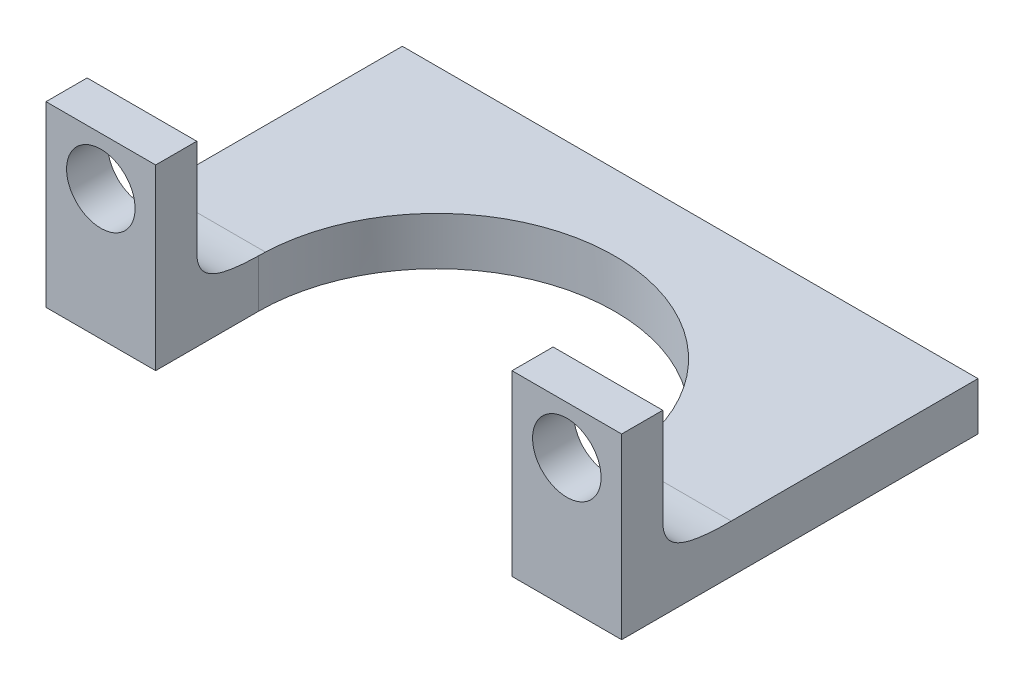
ISO-10303-21;
HEADER;
FILE_DESCRIPTION(('STEP AP214'),'2;1');
FILE_NAME('part.step','',(''),(''),'','','');
FILE_SCHEMA(('AUTOMOTIVE_DESIGN { 1 0 10303 214 1 1 1 1 }'));
ENDSEC;
DATA;
#1=APPLICATION_CONTEXT('core data for automotive mechanical design processes');
#2=APPLICATION_PROTOCOL_DEFINITION('international standard','automotive_design',2000,#1);
#3=PRODUCT_CONTEXT('',#1,'mechanical');
#4=PRODUCT('Part','Part','',(#3));
#5=PRODUCT_RELATED_PRODUCT_CATEGORY('part','',(#4));
#6=PRODUCT_DEFINITION_FORMATION('','',#4);
#7=PRODUCT_DEFINITION_CONTEXT('part definition',#1,'design');
#8=PRODUCT_DEFINITION('design','',#6,#7);
#9=PRODUCT_DEFINITION_SHAPE('','',#8);
#10=(LENGTH_UNIT() NAMED_UNIT(*) SI_UNIT(.MILLI.,.METRE.));
#11=(NAMED_UNIT(*) PLANE_ANGLE_UNIT() SI_UNIT($,.RADIAN.));
#12=(NAMED_UNIT(*) SI_UNIT($,.STERADIAN.) SOLID_ANGLE_UNIT());
#13=UNCERTAINTY_MEASURE_WITH_UNIT(LENGTH_MEASURE(1.E-05),#10,'distance_accuracy_value','');
#14=(GEOMETRIC_REPRESENTATION_CONTEXT(3) GLOBAL_UNCERTAINTY_ASSIGNED_CONTEXT((#13)) GLOBAL_UNIT_ASSIGNED_CONTEXT((#10,
#11,#12)) REPRESENTATION_CONTEXT('',''));
#15=CARTESIAN_POINT('',(0.,0.,0.));
#16=DIRECTION('',(0.,0.,1.));
#17=DIRECTION('',(1.,0.,0.));
#18=AXIS2_PLACEMENT_3D('',#15,#16,#17);
#19=CARTESIAN_POINT('',(-21.,3.5,13.));
#20=DIRECTION('',(0.,0.,-1.));
#21=DIRECTION('',(-1.,0.,0.));
#22=AXIS2_PLACEMENT_3D('',#19,#20,#21);
#23=PLANE('',#22);
#24=CARTESIAN_POINT('',(17.,9.5,13.));
#25=DIRECTION('',(0.,0.,-1.));
#26=DIRECTION('',(-1.,0.,0.));
#27=AXIS2_PLACEMENT_3D('',#24,#25,#26);
#28=CIRCLE('',#27,2.5);
#29=CARTESIAN_POINT('',(14.5,9.5,13.));
#30=VERTEX_POINT('',#29);
#31=EDGE_CURVE('E364',#30,#30,#28,.F.);
#32=ORIENTED_EDGE('',*,*,#31,.F.);
#33=EDGE_LOOP('',(#32));
#34=FACE_BOUND('',#33,.T.);
#35=DIRECTION('',(1.,0.,0.));
#36=VECTOR('',#35,1.);
#37=CARTESIAN_POINT('',(-21.,13.,13.));
#38=LINE('',#37,#36);
#39=CARTESIAN_POINT('',(13.,13.,13.));
#40=VERTEX_POINT('',#39);
#41=CARTESIAN_POINT('',(21.,13.,13.));
#42=VERTEX_POINT('',#41);
#43=EDGE_CURVE('E159',#40,#42,#38,.T.);
#44=ORIENTED_EDGE('',*,*,#43,.F.);
#45=DIRECTION('',(0.,-1.,0.));
#46=VECTOR('',#45,1.);
#47=CARTESIAN_POINT('',(13.,46.1096662622866,13.));
#48=LINE('',#47,#46);
#49=CARTESIAN_POINT('',(13.,0.,13.));
#50=VERTEX_POINT('',#49);
#51=EDGE_CURVE('E143',#40,#50,#48,.T.);
#52=ORIENTED_EDGE('',*,*,#51,.T.);
#53=DIRECTION('',(1.,0.,0.));
#54=VECTOR('',#53,1.);
#55=CARTESIAN_POINT('',(-21.,0.,13.));
#56=LINE('',#55,#54);
#57=CARTESIAN_POINT('',(21.,0.,13.));
#58=VERTEX_POINT('',#57);
#59=EDGE_CURVE('E509',#50,#58,#56,.T.);
#60=ORIENTED_EDGE('',*,*,#59,.T.);
#61=DIRECTION('',(0.,-1.,0.));
#62=VECTOR('',#61,1.);
#63=CARTESIAN_POINT('',(21.,3.5,13.));
#64=LINE('',#63,#62);
#65=EDGE_CURVE('E167',#42,#58,#64,.T.);
#66=ORIENTED_EDGE('',*,*,#65,.F.);
#67=EDGE_LOOP('',(#44,#52,#60,#66));
#68=FACE_BOUND('',#67,.T.);
#69=ADVANCED_FACE('F38',(#34,#68),#23,.F.);
#70=CARTESIAN_POINT('',(-21.,13.,10.));
#71=DIRECTION('',(0.,0.,1.));
#72=DIRECTION('',(1.,0.,0.));
#73=AXIS2_PLACEMENT_3D('',#70,#71,#72);
#74=PLANE('',#73);
#75=CARTESIAN_POINT('',(17.,9.5,10.));
#76=DIRECTION('',(0.,0.,-1.));
#77=DIRECTION('',(-1.,0.,0.));
#78=AXIS2_PLACEMENT_3D('',#75,#76,#77);
#79=CIRCLE('',#78,2.5);
#80=CARTESIAN_POINT('',(14.5,9.5,10.));
#81=VERTEX_POINT('',#80);
#82=EDGE_CURVE('E367',#81,#81,#79,.T.);
#83=ORIENTED_EDGE('',*,*,#82,.F.);
#84=EDGE_LOOP('',(#83));
#85=FACE_BOUND('',#84,.T.);
#86=DIRECTION('',(0.,-1.,0.));
#87=VECTOR('',#86,1.);
#88=CARTESIAN_POINT('',(21.,13.,10.));
#89=LINE('',#88,#87);
#90=CARTESIAN_POINT('',(21.,13.,10.));
#91=VERTEX_POINT('',#90);
#92=CARTESIAN_POINT('',(21.,6.,10.));
#93=VERTEX_POINT('',#92);
#94=EDGE_CURVE('E214',#91,#93,#89,.T.);
#95=ORIENTED_EDGE('',*,*,#94,.T.);
#96=CARTESIAN_POINT('',(12.5899001096049,6.,10.));
#97=CARTESIAN_POINT('',(15.5267603887905,6.,10.));
#98=CARTESIAN_POINT('',(18.4636206679761,6.,10.));
#99=CARTESIAN_POINT('',(21.4004809471617,6.,10.));
#100=(BOUNDED_CURVE() B_SPLINE_CURVE(3,(#96,#97,#98,#99),.UNSPECIFIED.,.F.,
.F.) B_SPLINE_CURVE_WITH_KNOTS((4,4),(-0.0424004809471617,-0.0335899001096049),
.UNSPECIFIED.) CURVE() GEOMETRIC_REPRESENTATION_ITEM() RATIONAL_B_SPLINE_CURVE((1.,1.,1.,1.)) REPRESENTATION_ITEM(''));
#101=CARTESIAN_POINT('',(13.,6.,10.));
#102=VERTEX_POINT('',#101);
#103=EDGE_CURVE('E163',#93,#102,#100,.F.);
#104=ORIENTED_EDGE('',*,*,#103,.T.);
#105=DIRECTION('',(0.,1.,0.));
#106=VECTOR('',#105,1.);
#107=CARTESIAN_POINT('',(13.,13.,10.));
#108=LINE('',#107,#106);
#109=CARTESIAN_POINT('',(13.,13.,10.));
#110=VERTEX_POINT('',#109);
#111=EDGE_CURVE('E198',#102,#110,#108,.T.);
#112=ORIENTED_EDGE('',*,*,#111,.T.);
#113=DIRECTION('',(-1.,0.,0.));
#114=VECTOR('',#113,1.);
#115=CARTESIAN_POINT('',(-21.,13.,10.));
#116=LINE('',#115,#114);
#117=EDGE_CURVE('E162',#91,#110,#116,.T.);
#118=ORIENTED_EDGE('',*,*,#117,.F.);
#119=EDGE_LOOP('',(#95,#104,#112,#118));
#120=FACE_BOUND('',#119,.T.);
#121=ADVANCED_FACE('F212',(#85,#120),#74,.F.);
#122=CARTESIAN_POINT('',(0.,13.,0.));
#123=DIRECTION('',(0.,1.,0.));
#124=DIRECTION('',(0.,0.,1.));
#125=AXIS2_PLACEMENT_3D('',#122,#123,#124);
#126=PLANE('',#125);
#127=DIRECTION('',(0.,0.,-1.));
#128=VECTOR('',#127,1.);
#129=CARTESIAN_POINT('',(13.,13.,0.));
#130=LINE('',#129,#128);
#131=EDGE_CURVE('E147',#40,#110,#130,.T.);
#132=ORIENTED_EDGE('',*,*,#131,.F.);
#133=ORIENTED_EDGE('',*,*,#43,.T.);
#134=DIRECTION('',(0.,0.,-1.));
#135=VECTOR('',#134,1.);
#136=CARTESIAN_POINT('',(21.,13.,10.));
#137=LINE('',#136,#135);
#138=EDGE_CURVE('E173',#42,#91,#137,.T.);
#139=ORIENTED_EDGE('',*,*,#138,.T.);
#140=ORIENTED_EDGE('',*,*,#117,.T.);
#141=EDGE_LOOP('',(#132,#133,#139,#140));
#142=FACE_BOUND('',#141,.T.);
#143=ADVANCED_FACE('F158',(#142),#126,.T.);
#144=CARTESIAN_POINT('',(21.,3.5,-13.));
#145=DIRECTION('',(-1.,0.,0.));
#146=DIRECTION('',(0.,0.,1.));
#147=AXIS2_PLACEMENT_3D('',#144,#145,#146);
#148=PLANE('',#147);
#149=DIRECTION('',(0.,0.,-1.));
#150=VECTOR('',#149,1.);
#151=CARTESIAN_POINT('',(21.,0.,-13.));
#152=LINE('',#151,#150);
#153=CARTESIAN_POINT('',(21.,0.,-13.));
#154=VERTEX_POINT('',#153);
#155=EDGE_CURVE('E503',#58,#154,#152,.T.);
#156=ORIENTED_EDGE('',*,*,#155,.T.);
#157=DIRECTION('',(0.,-1.,0.));
#158=VECTOR('',#157,1.);
#159=CARTESIAN_POINT('',(21.,3.5,-13.));
#160=LINE('',#159,#158);
#161=CARTESIAN_POINT('',(21.,3.5,-13.));
#162=VERTEX_POINT('',#161);
#163=EDGE_CURVE('E164',#162,#154,#160,.T.);
#164=ORIENTED_EDGE('',*,*,#163,.F.);
#165=DIRECTION('',(0.,0.,-1.));
#166=VECTOR('',#165,1.);
#167=CARTESIAN_POINT('',(21.,3.5,-13.));
#168=LINE('',#167,#166);
#169=CARTESIAN_POINT('',(21.,3.5,4.99999999999999));
#170=VERTEX_POINT('',#169);
#171=EDGE_CURVE('E188',#170,#162,#168,.T.);
#172=ORIENTED_EDGE('',*,*,#171,.F.);
#173=CARTESIAN_POINT('',(21.,6.,10.));
#174=CARTESIAN_POINT('',(21.,3.5,10.));
#175=CARTESIAN_POINT('',(21.,3.5,5.));
#176=(BOUNDED_CURVE() B_SPLINE_CURVE(2,(#173,#174,#175),.UNSPECIFIED.,.F.,
.F.) B_SPLINE_CURVE_WITH_KNOTS((3,3),(0.,1.),
.UNSPECIFIED.) CURVE() GEOMETRIC_REPRESENTATION_ITEM() RATIONAL_B_SPLINE_CURVE((1.,
1.22222222222222,1.)) REPRESENTATION_ITEM(''));
#177=EDGE_CURVE('E234',#170,#93,#176,.F.);
#178=ORIENTED_EDGE('',*,*,#177,.T.);
#179=ORIENTED_EDGE('',*,*,#94,.F.);
#180=ORIENTED_EDGE('',*,*,#138,.F.);
#181=ORIENTED_EDGE('',*,*,#65,.T.);
#182=EDGE_LOOP('',(#156,#164,#172,#178,#179,#180,#181));
#183=FACE_BOUND('',#182,.T.);
#184=ADVANCED_FACE('F258',(#183),#148,.F.);
#185=CARTESIAN_POINT('',(-21.,3.5,-13.));
#186=DIRECTION('',(0.,0.,1.));
#187=DIRECTION('',(1.,0.,0.));
#188=AXIS2_PLACEMENT_3D('',#185,#186,#187);
#189=PLANE('',#188);
#190=DIRECTION('',(-1.,0.,0.));
#191=VECTOR('',#190,1.);
#192=CARTESIAN_POINT('',(-21.,0.,-13.));
#193=LINE('',#192,#191);
#194=CARTESIAN_POINT('',(-21.,0.,-13.));
#195=VERTEX_POINT('',#194);
#196=EDGE_CURVE('E505',#154,#195,#193,.T.);
#197=ORIENTED_EDGE('',*,*,#196,.T.);
#198=DIRECTION('',(0.,-1.,0.));
#199=VECTOR('',#198,1.);
#200=CARTESIAN_POINT('',(-21.,3.5,-13.));
#201=LINE('',#200,#199);
#202=CARTESIAN_POINT('',(-21.,3.5,-13.));
#203=VERTEX_POINT('',#202);
#204=EDGE_CURVE('E513',#203,#195,#201,.T.);
#205=ORIENTED_EDGE('',*,*,#204,.F.);
#206=DIRECTION('',(-1.,0.,0.));
#207=VECTOR('',#206,1.);
#208=CARTESIAN_POINT('',(-21.,3.5,-13.));
#209=LINE('',#208,#207);
#210=EDGE_CURVE('E185',#162,#203,#209,.T.);
#211=ORIENTED_EDGE('',*,*,#210,.F.);
#212=ORIENTED_EDGE('',*,*,#163,.T.);
#213=EDGE_LOOP('',(#197,#205,#211,#212));
#214=FACE_BOUND('',#213,.T.);
#215=ADVANCED_FACE('F435',(#214),#189,.F.);
#216=CARTESIAN_POINT('',(-21.,3.5,-13.));
#217=DIRECTION('',(1.,0.,0.));
#218=DIRECTION('',(0.,0.,-1.));
#219=AXIS2_PLACEMENT_3D('',#216,#217,#218);
#220=PLANE('',#219);
#221=DIRECTION('',(0.,0.,1.));
#222=VECTOR('',#221,1.);
#223=CARTESIAN_POINT('',(-21.,0.,-13.));
#224=LINE('',#223,#222);
#225=CARTESIAN_POINT('',(-21.,0.,13.));
#226=VERTEX_POINT('',#225);
#227=EDGE_CURVE('E507',#195,#226,#224,.T.);
#228=ORIENTED_EDGE('',*,*,#227,.T.);
#229=DIRECTION('',(0.,-1.,0.));
#230=VECTOR('',#229,1.);
#231=CARTESIAN_POINT('',(-21.,3.5,13.));
#232=LINE('',#231,#230);
#233=CARTESIAN_POINT('',(-21.,13.,13.));
#234=VERTEX_POINT('',#233);
#235=EDGE_CURVE('E495',#234,#226,#232,.T.);
#236=ORIENTED_EDGE('',*,*,#235,.F.);
#237=DIRECTION('',(0.,0.,1.));
#238=VECTOR('',#237,1.);
#239=CARTESIAN_POINT('',(-21.,13.,10.));
#240=LINE('',#239,#238);
#241=CARTESIAN_POINT('',(-21.,13.,10.));
#242=VERTEX_POINT('',#241);
#243=EDGE_CURVE('E170',#242,#234,#240,.T.);
#244=ORIENTED_EDGE('',*,*,#243,.F.);
#245=DIRECTION('',(0.,-1.,0.));
#246=VECTOR('',#245,1.);
#247=CARTESIAN_POINT('',(-21.,13.,10.));
#248=LINE('',#247,#246);
#249=CARTESIAN_POINT('',(-21.,6.,10.));
#250=VERTEX_POINT('',#249);
#251=EDGE_CURVE('E182',#242,#250,#248,.T.);
#252=ORIENTED_EDGE('',*,*,#251,.T.);
#253=CARTESIAN_POINT('',(-21.,3.5,5.));
#254=CARTESIAN_POINT('',(-21.,3.5,10.));
#255=CARTESIAN_POINT('',(-21.,6.,10.));
#256=(BOUNDED_CURVE() B_SPLINE_CURVE(2,(#253,#254,#255),.UNSPECIFIED.,.F.,
.F.) B_SPLINE_CURVE_WITH_KNOTS((3,3),(0.,1.),
.UNSPECIFIED.) CURVE() GEOMETRIC_REPRESENTATION_ITEM() RATIONAL_B_SPLINE_CURVE((1.,
1.22222222222222,1.)) REPRESENTATION_ITEM(''));
#257=CARTESIAN_POINT('',(-21.,3.5,4.99999999999999));
#258=VERTEX_POINT('',#257);
#259=EDGE_CURVE('E297',#250,#258,#256,.F.);
#260=ORIENTED_EDGE('',*,*,#259,.T.);
#261=DIRECTION('',(0.,0.,1.));
#262=VECTOR('',#261,1.);
#263=CARTESIAN_POINT('',(-21.,3.5,-13.));
#264=LINE('',#263,#262);
#265=EDGE_CURVE('E490',#203,#258,#264,.T.);
#266=ORIENTED_EDGE('',*,*,#265,.F.);
#267=ORIENTED_EDGE('',*,*,#204,.T.);
#268=EDGE_LOOP('',(#228,#236,#244,#252,#260,#266,#267));
#269=FACE_BOUND('',#268,.T.);
#270=ADVANCED_FACE('F431',(#269),#220,.F.);
#271=CARTESIAN_POINT('',(-17.,9.5,13.));
#272=DIRECTION('',(0.,0.,-1.));
#273=DIRECTION('',(-1.,0.,0.));
#274=AXIS2_PLACEMENT_3D('',#271,#272,#273);
#275=CIRCLE('',#274,2.5);
#276=CARTESIAN_POINT('',(-19.5,9.5,13.));
#277=VERTEX_POINT('',#276);
#278=EDGE_CURVE('E356',#277,#277,#275,.F.);
#279=ORIENTED_EDGE('',*,*,#278,.F.);
#280=EDGE_LOOP('',(#279));
#281=FACE_BOUND('',#280,.T.);
#282=CARTESIAN_POINT('',(-13.,0.,13.));
#283=VERTEX_POINT('',#282);
#284=EDGE_CURVE('E191',#226,#283,#56,.T.);
#285=ORIENTED_EDGE('',*,*,#284,.T.);
#286=DIRECTION('',(0.,-1.,0.));
#287=VECTOR('',#286,1.);
#288=CARTESIAN_POINT('',(-13.,46.1096662622866,13.));
#289=LINE('',#288,#287);
#290=CARTESIAN_POINT('',(-13.,13.,13.));
#291=VERTEX_POINT('',#290);
#292=EDGE_CURVE('E154',#291,#283,#289,.T.);
#293=ORIENTED_EDGE('',*,*,#292,.F.);
#294=EDGE_CURVE('E169',#234,#291,#38,.T.);
#295=ORIENTED_EDGE('',*,*,#294,.F.);
#296=ORIENTED_EDGE('',*,*,#235,.T.);
#297=EDGE_LOOP('',(#285,#293,#295,#296));
#298=FACE_BOUND('',#297,.T.);
#299=ADVANCED_FACE('F382',(#281,#298),#23,.F.);
#300=CARTESIAN_POINT('',(0.,3.5,0.));
#301=DIRECTION('',(0.,1.,0.));
#302=DIRECTION('',(0.,0.,1.));
#303=AXIS2_PLACEMENT_3D('',#300,#301,#302);
#304=PLANE('',#303);
#305=CARTESIAN_POINT('',(0.,3.5,5.5));
#306=DIRECTION('',(0.,1.,0.));
#307=DIRECTION('',(0.,0.,1.));
#308=AXIS2_PLACEMENT_3D('',#305,#306,#307);
#309=CIRCLE('',#308,13.);
#310=CARTESIAN_POINT('',(12.9903810567666,3.5,5.));
#311=VERTEX_POINT('',#310);
#312=CARTESIAN_POINT('',(-12.9903810567666,3.5,5.));
#313=VERTEX_POINT('',#312);
#314=EDGE_CURVE('E175',#311,#313,#309,.T.);
#315=ORIENTED_EDGE('',*,*,#314,.F.);
#316=CARTESIAN_POINT('',(21.4004809471617,3.5,5.));
#317=CARTESIAN_POINT('',(18.4636206679761,3.5,5.));
#318=CARTESIAN_POINT('',(15.5267603887905,3.5,5.));
#319=CARTESIAN_POINT('',(12.5899001096049,3.5,5.));
#320=(BOUNDED_CURVE() B_SPLINE_CURVE(3,(#316,#317,#318,#319),.UNSPECIFIED.,.F.,
.F.) B_SPLINE_CURVE_WITH_KNOTS((4,4),(-0.0424004809471617,-0.0335899001096049),
.UNSPECIFIED.) CURVE() GEOMETRIC_REPRESENTATION_ITEM() RATIONAL_B_SPLINE_CURVE((1.,1.,1.,1.)) REPRESENTATION_ITEM(''));
#321=EDGE_CURVE('E230',#311,#170,#320,.F.);
#322=ORIENTED_EDGE('',*,*,#321,.T.);
#323=ORIENTED_EDGE('',*,*,#171,.T.);
#324=ORIENTED_EDGE('',*,*,#210,.T.);
#325=ORIENTED_EDGE('',*,*,#265,.T.);
#326=CARTESIAN_POINT('',(-12.5899001096049,3.5,5.));
#327=CARTESIAN_POINT('',(-15.5267603887905,3.5,5.));
#328=CARTESIAN_POINT('',(-18.4636206679761,3.5,5.));
#329=CARTESIAN_POINT('',(-21.4004809471617,3.5,5.));
#330=(BOUNDED_CURVE() B_SPLINE_CURVE(3,(#326,#327,#328,#329),.UNSPECIFIED.,.F.,
.F.) B_SPLINE_CURVE_WITH_KNOTS((4,4),(-0.00841009989039509,0.000400480947161671),
.UNSPECIFIED.) CURVE() GEOMETRIC_REPRESENTATION_ITEM() RATIONAL_B_SPLINE_CURVE((1.,1.,1.,1.)) REPRESENTATION_ITEM(''));
#331=EDGE_CURVE('E218',#258,#313,#330,.F.);
#332=ORIENTED_EDGE('',*,*,#331,.T.);
#333=EDGE_LOOP('',(#315,#322,#323,#324,#325,#332));
#334=FACE_BOUND('',#333,.T.);
#335=ADVANCED_FACE('F392',(#334),#304,.T.);
#336=CARTESIAN_POINT('',(0.,0.,0.));
#337=DIRECTION('',(0.,1.,0.));
#338=DIRECTION('',(0.,0.,1.));
#339=AXIS2_PLACEMENT_3D('',#336,#337,#338);
#340=PLANE('',#339);
#341=ORIENTED_EDGE('',*,*,#59,.F.);
#342=DIRECTION('',(0.,0.,1.));
#343=VECTOR('',#342,1.);
#344=CARTESIAN_POINT('',(13.,0.,0.));
#345=LINE('',#344,#343);
#346=CARTESIAN_POINT('',(13.,0.,5.5));
#347=VERTEX_POINT('',#346);
#348=EDGE_CURVE('E150',#347,#50,#345,.T.);
#349=ORIENTED_EDGE('',*,*,#348,.F.);
#350=CARTESIAN_POINT('',(0.,0.,5.5));
#351=DIRECTION('',(0.,-1.,0.));
#352=DIRECTION('',(0.,0.,-1.));
#353=AXIS2_PLACEMENT_3D('',#350,#351,#352);
#354=CIRCLE('',#353,13.);
#355=CARTESIAN_POINT('',(-13.,0.,5.5));
#356=VERTEX_POINT('',#355);
#357=EDGE_CURVE('E354',#356,#347,#354,.T.);
#358=ORIENTED_EDGE('',*,*,#357,.F.);
#359=DIRECTION('',(0.,0.,-1.));
#360=VECTOR('',#359,1.);
#361=CARTESIAN_POINT('',(-13.,0.,0.));
#362=LINE('',#361,#360);
#363=EDGE_CURVE('E155',#283,#356,#362,.T.);
#364=ORIENTED_EDGE('',*,*,#363,.F.);
#365=ORIENTED_EDGE('',*,*,#284,.F.);
#366=ORIENTED_EDGE('',*,*,#227,.F.);
#367=ORIENTED_EDGE('',*,*,#196,.F.);
#368=ORIENTED_EDGE('',*,*,#155,.F.);
#369=EDGE_LOOP('',(#341,#349,#358,#364,#365,#366,#367,#368));
#370=FACE_BOUND('',#369,.T.);
#371=ADVANCED_FACE('F386',(#370),#340,.F.);
#372=CARTESIAN_POINT('',(-17.,9.5,10.));
#373=DIRECTION('',(0.,0.,-1.));
#374=DIRECTION('',(-1.,0.,0.));
#375=AXIS2_PLACEMENT_3D('',#372,#373,#374);
#376=CIRCLE('',#375,2.5);
#377=CARTESIAN_POINT('',(-19.5,9.5,10.));
#378=VERTEX_POINT('',#377);
#379=EDGE_CURVE('E361',#378,#378,#376,.T.);
#380=ORIENTED_EDGE('',*,*,#379,.F.);
#381=EDGE_LOOP('',(#380));
#382=FACE_BOUND('',#381,.T.);
#383=DIRECTION('',(0.,-1.,0.));
#384=VECTOR('',#383,1.);
#385=CARTESIAN_POINT('',(-13.,13.,10.));
#386=LINE('',#385,#384);
#387=CARTESIAN_POINT('',(-13.,13.,10.));
#388=VERTEX_POINT('',#387);
#389=CARTESIAN_POINT('',(-13.,6.,10.));
#390=VERTEX_POINT('',#389);
#391=EDGE_CURVE('E206',#388,#390,#386,.T.);
#392=ORIENTED_EDGE('',*,*,#391,.T.);
#393=CARTESIAN_POINT('',(-21.4004809471617,6.,10.));
#394=CARTESIAN_POINT('',(-18.4636206679761,6.,10.));
#395=CARTESIAN_POINT('',(-15.5267603887905,6.,10.));
#396=CARTESIAN_POINT('',(-12.5899001096049,6.,10.));
#397=(BOUNDED_CURVE() B_SPLINE_CURVE(3,(#393,#394,#395,#396),.UNSPECIFIED.,.F.,
.F.) B_SPLINE_CURVE_WITH_KNOTS((4,4),(-0.00841009989039509,0.00040048094716167),
.UNSPECIFIED.) CURVE() GEOMETRIC_REPRESENTATION_ITEM() RATIONAL_B_SPLINE_CURVE((1.,1.,1.,1.)) REPRESENTATION_ITEM(''));
#398=EDGE_CURVE('E224',#390,#250,#397,.F.);
#399=ORIENTED_EDGE('',*,*,#398,.T.);
#400=ORIENTED_EDGE('',*,*,#251,.F.);
#401=EDGE_CURVE('E180',#388,#242,#116,.T.);
#402=ORIENTED_EDGE('',*,*,#401,.F.);
#403=EDGE_LOOP('',(#392,#399,#400,#402));
#404=FACE_BOUND('',#403,.T.);
#405=ADVANCED_FACE('F373',(#382,#404),#74,.F.);
#406=DIRECTION('',(0.,0.,-1.));
#407=VECTOR('',#406,1.);
#408=CARTESIAN_POINT('',(-13.,13.,0.));
#409=LINE('',#408,#407);
#410=EDGE_CURVE('E347',#291,#388,#409,.T.);
#411=ORIENTED_EDGE('',*,*,#410,.T.);
#412=ORIENTED_EDGE('',*,*,#401,.T.);
#413=ORIENTED_EDGE('',*,*,#243,.T.);
#414=ORIENTED_EDGE('',*,*,#294,.T.);
#415=EDGE_LOOP('',(#411,#412,#413,#414));
#416=FACE_BOUND('',#415,.T.);
#417=ADVANCED_FACE('F379',(#416),#126,.T.);
#418=CARTESIAN_POINT('',(13.,46.1096662622866,0.));
#419=DIRECTION('',(1.,0.,0.));
#420=DIRECTION('',(0.,0.,-1.));
#421=AXIS2_PLACEMENT_3D('',#418,#419,#420);
#422=PLANE('',#421);
#423=ORIENTED_EDGE('',*,*,#111,.F.);
#424=CARTESIAN_POINT('',(13.,3.5,5.));
#425=CARTESIAN_POINT('',(13.,3.5,10.));
#426=CARTESIAN_POINT('',(13.,6.,10.));
#427=(BOUNDED_CURVE() B_SPLINE_CURVE(2,(#424,#425,#426),.UNSPECIFIED.,.F.,
.F.) B_SPLINE_CURVE_WITH_KNOTS((3,3),(0.,1.),
.UNSPECIFIED.) CURVE() GEOMETRIC_REPRESENTATION_ITEM() RATIONAL_B_SPLINE_CURVE((1.,
1.22222222222222,1.)) REPRESENTATION_ITEM(''));
#428=CARTESIAN_POINT('',(13.,3.50448351328304,5.5));
#429=VERTEX_POINT('',#428);
#430=EDGE_CURVE('E219',#102,#429,#427,.F.);
#431=ORIENTED_EDGE('',*,*,#430,.T.);
#432=DIRECTION('',(0.,-1.,0.));
#433=VECTOR('',#432,1.);
#434=CARTESIAN_POINT('',(13.,46.1096662622866,5.5));
#435=LINE('',#434,#433);
#436=EDGE_CURVE('E65',#429,#347,#435,.T.);
#437=ORIENTED_EDGE('',*,*,#436,.T.);
#438=ORIENTED_EDGE('',*,*,#348,.T.);
#439=ORIENTED_EDGE('',*,*,#51,.F.);
#440=ORIENTED_EDGE('',*,*,#131,.T.);
#441=EDGE_LOOP('',(#423,#431,#437,#438,#439,#440));
#442=FACE_BOUND('',#441,.T.);
#443=ADVANCED_FACE('F146',(#442),#422,.F.);
#444=CARTESIAN_POINT('',(-13.,46.1096662622866,0.));
#445=DIRECTION('',(-1.,0.,0.));
#446=DIRECTION('',(0.,0.,1.));
#447=AXIS2_PLACEMENT_3D('',#444,#445,#446);
#448=PLANE('',#447);
#449=DIRECTION('',(0.,-1.,0.));
#450=VECTOR('',#449,1.);
#451=CARTESIAN_POINT('',(-13.,46.1096662622866,5.5));
#452=LINE('',#451,#450);
#453=CARTESIAN_POINT('',(-13.,3.50448351328304,5.5));
#454=VERTEX_POINT('',#453);
#455=EDGE_CURVE('E57',#454,#356,#452,.T.);
#456=ORIENTED_EDGE('',*,*,#455,.F.);
#457=CARTESIAN_POINT('',(-13.,6.,10.));
#458=CARTESIAN_POINT('',(-13.,3.5,10.));
#459=CARTESIAN_POINT('',(-13.,3.5,5.));
#460=(BOUNDED_CURVE() B_SPLINE_CURVE(2,(#457,#458,#459),.UNSPECIFIED.,.F.,
.F.) B_SPLINE_CURVE_WITH_KNOTS((3,3),(0.,1.),
.UNSPECIFIED.) CURVE() GEOMETRIC_REPRESENTATION_ITEM() RATIONAL_B_SPLINE_CURVE((1.,
1.22222222222222,1.)) REPRESENTATION_ITEM(''));
#461=EDGE_CURVE('E12',#454,#390,#460,.F.);
#462=ORIENTED_EDGE('',*,*,#461,.T.);
#463=ORIENTED_EDGE('',*,*,#391,.F.);
#464=ORIENTED_EDGE('',*,*,#410,.F.);
#465=ORIENTED_EDGE('',*,*,#292,.T.);
#466=ORIENTED_EDGE('',*,*,#363,.T.);
#467=EDGE_LOOP('',(#456,#462,#463,#464,#465,#466));
#468=FACE_BOUND('',#467,.T.);
#469=ADVANCED_FACE('F462',(#468),#448,.F.);
#470=CARTESIAN_POINT('',(0.,46.1096662622866,5.5));
#471=DIRECTION('',(0.,-1.,0.));
#472=DIRECTION('',(0.,0.,-1.));
#473=AXIS2_PLACEMENT_3D('',#470,#471,#472);
#474=CYLINDRICAL_SURFACE('',#473,13.);
#475=ORIENTED_EDGE('',*,*,#436,.F.);
#476=CARTESIAN_POINT('',(12.9903810567666,3.5,5.));
#477=CARTESIAN_POINT('',(12.9911827831138,3.50000000650922,5.02082981728888));
#478=CARTESIAN_POINT('',(12.9919342311955,3.50002178399207,5.04166157132385));
#479=CARTESIAN_POINT('',(12.9933369580765,3.50011005041632,5.08333418858855));
#480=CARTESIAN_POINT('',(12.9939882088061,3.5001765518589,5.10417505273656));
#481=CARTESIAN_POINT('',(12.9951905385073,3.50035544570524,5.1458615023687));
#482=CARTESIAN_POINT('',(12.9957416077325,3.50046784257056,5.16670708811488));
#483=CARTESIAN_POINT('',(12.9967435517983,3.50073972264262,5.20839865126464));
#484=CARTESIAN_POINT('',(12.9971944348484,3.50089920198877,5.22924462849605));
#485=CARTESIAN_POINT('',(12.9979959901105,3.50126644594555,5.27093270401067));
#486=CARTESIAN_POINT('',(12.9983466881494,3.5014741980867,5.29177480190687));
#487=CARTESIAN_POINT('',(12.998947854499,3.50193919488603,5.33345090694599));
#488=CARTESIAN_POINT('',(12.9991983659396,3.50219641817634,5.35428491370478));
#489=CARTESIAN_POINT('',(12.9995991457241,3.50276156802731,5.39594068491598));
#490=CARTESIAN_POINT('',(12.9997494742045,3.50306946403218,5.41676244920322));
#491=CARTESIAN_POINT('',(12.9999498568829,3.50373719018569,5.45838963946606));
#492=CARTESIAN_POINT('',(12.9999999879631,3.50409698028815,5.47919506571453));
#493=CARTESIAN_POINT('',(13.,3.50448351328305,5.5));
#494=B_SPLINE_CURVE_WITH_KNOTS('',3,(#476,#477,#478,#479,#480,#481,#482,#483,#484,#485,#486,
#487,#488,#489,#490,#491,#492,#493),.UNSPECIFIED.,.F.,.F.,(4,2,2,2,2,2,2,2,4),(0.,
0.0625356518656938,0.125088790868788,0.187648012181749,0.25020210531267,0.312740057859215,
0.375251059055018,0.437724503120805,0.500149992432577),.UNSPECIFIED.);
#495=EDGE_CURVE('E223',#429,#311,#494,.F.);
#496=ORIENTED_EDGE('',*,*,#495,.T.);
#497=ORIENTED_EDGE('',*,*,#314,.T.);
#498=CARTESIAN_POINT('',(-13.,3.50448351328304,5.49999999999967));
#499=CARTESIAN_POINT('',(-12.9999999879631,3.50409698028815,5.47919506571423));
#500=CARTESIAN_POINT('',(-12.9999498568829,3.50373719018569,5.45838963946579));
#501=CARTESIAN_POINT('',(-12.9997494742045,3.50306946403218,5.41676244920302));
#502=CARTESIAN_POINT('',(-12.9995991457241,3.50276156802731,5.39594068491581));
#503=CARTESIAN_POINT('',(-12.9991983659396,3.50219641817634,5.35428491370465));
#504=CARTESIAN_POINT('',(-12.998947854499,3.50193919488603,5.33345090694589));
#505=CARTESIAN_POINT('',(-12.9983466881494,3.5014741980867,5.29177480190681));
#506=CARTESIAN_POINT('',(-12.9979959901105,3.50126644594555,5.27093270401063));
#507=CARTESIAN_POINT('',(-12.9971944348484,3.50089920198878,5.22924462849604));
#508=CARTESIAN_POINT('',(-12.9967435517983,3.50073972264262,5.20839865126464));
#509=CARTESIAN_POINT('',(-12.9957416077326,3.50046784257056,5.1667070881149));
#510=CARTESIAN_POINT('',(-12.9951905385073,3.50035544570524,5.14586150236873));
#511=CARTESIAN_POINT('',(-12.9939882088061,3.5001765518589,5.10417505273658));
#512=CARTESIAN_POINT('',(-12.9933369580765,3.50011005041632,5.08333418858857));
#513=CARTESIAN_POINT('',(-12.9919342311955,3.50002178399207,5.04166157132387));
#514=CARTESIAN_POINT('',(-12.9911827831138,3.50000000650922,5.02082981728888));
#515=CARTESIAN_POINT('',(-12.9903810567666,3.5,5.));
#516=B_SPLINE_CURVE_WITH_KNOTS('',3,(#498,#499,#500,#501,#502,#503,#504,#505,#506,#507,#508,
#509,#510,#511,#512,#513,#514,#515),.UNSPECIFIED.,.F.,.F.,(4,2,2,2,2,2,2,2,4),(0.,
0.0624254893116675,0.124898933377369,0.187409934573104,0.249947887119594,0.312501980250481,
0.375061201563429,0.437614340566526,0.500149992432244),.UNSPECIFIED.);
#517=EDGE_CURVE('E51',#313,#454,#516,.F.);
#518=ORIENTED_EDGE('',*,*,#517,.T.);
#519=ORIENTED_EDGE('',*,*,#455,.T.);
#520=ORIENTED_EDGE('',*,*,#357,.T.);
#521=EDGE_LOOP('',(#475,#496,#497,#518,#519,#520));
#522=FACE_BOUND('',#521,.T.);
#523=ADVANCED_FACE('F452',(#522),#474,.F.);
#524=CARTESIAN_POINT('',(-17.,9.5,20.0710678118655));
#525=DIRECTION('',(0.,0.,-1.));
#526=DIRECTION('',(-1.,0.,0.));
#527=AXIS2_PLACEMENT_3D('',#524,#525,#526);
#528=CYLINDRICAL_SURFACE('',#527,2.5);
#529=ORIENTED_EDGE('',*,*,#278,.T.);
#530=EDGE_LOOP('',(#529));
#531=FACE_BOUND('',#530,.T.);
#532=ORIENTED_EDGE('',*,*,#379,.T.);
#533=EDGE_LOOP('',(#532));
#534=FACE_BOUND('',#533,.T.);
#535=ADVANCED_FACE('F461',(#531,#534),#528,.F.);
#536=CARTESIAN_POINT('',(17.,9.5,20.0710678118655));
#537=DIRECTION('',(0.,0.,-1.));
#538=DIRECTION('',(-1.,0.,0.));
#539=AXIS2_PLACEMENT_3D('',#536,#537,#538);
#540=CYLINDRICAL_SURFACE('',#539,2.5);
#541=ORIENTED_EDGE('',*,*,#31,.T.);
#542=EDGE_LOOP('',(#541));
#543=FACE_BOUND('',#542,.T.);
#544=ORIENTED_EDGE('',*,*,#82,.T.);
#545=EDGE_LOOP('',(#544));
#546=FACE_BOUND('',#545,.T.);
#547=ADVANCED_FACE('F257',(#543,#546),#540,.F.);
#548=CARTESIAN_POINT('',(21.4004809471617,6.,10.));
#549=CARTESIAN_POINT('',(18.4636206679761,6.,10.));
#550=CARTESIAN_POINT('',(15.5267603887905,6.,10.));
#551=CARTESIAN_POINT('',(12.5899001096049,6.,10.));
#552=CARTESIAN_POINT('',(21.4004809471617,3.5,10.));
#553=CARTESIAN_POINT('',(18.4636206679761,3.5,10.));
#554=CARTESIAN_POINT('',(15.5267603887905,3.5,10.));
#555=CARTESIAN_POINT('',(12.5899001096049,3.5,10.));
#556=CARTESIAN_POINT('',(21.4004809471617,3.5,5.));
#557=CARTESIAN_POINT('',(18.4636206679761,3.5,5.));
#558=CARTESIAN_POINT('',(15.5267603887905,3.5,5.));
#559=CARTESIAN_POINT('',(12.5899001096049,3.5,5.));
#560=(BOUNDED_SURFACE() B_SPLINE_SURFACE(2,3,((#548,#549,#550,#551),(#552,#553,#554,#555),(#556,
#557,#558,#559)),.UNSPECIFIED.,.F.,.F.,.F.) B_SPLINE_SURFACE_WITH_KNOTS((3,3),(4,4),(0.,1.),
(-0.0424004809471617,-0.0335899001096049),
.UNSPECIFIED.) GEOMETRIC_REPRESENTATION_ITEM() RATIONAL_B_SPLINE_SURFACE(((1.,1.,1.,1.),
(1.22222222222222,1.22222222222222,1.22222222222222,1.22222222222222),(1.,1.,1.,1.))) REPRESENTATION_ITEM('') SURFACE());
#561=ORIENTED_EDGE('',*,*,#177,.F.);
#562=ORIENTED_EDGE('',*,*,#321,.F.);
#563=ORIENTED_EDGE('',*,*,#495,.F.);
#564=ORIENTED_EDGE('',*,*,#430,.F.);
#565=ORIENTED_EDGE('',*,*,#103,.F.);
#566=EDGE_LOOP('',(#561,#562,#563,#564,#565));
#567=FACE_BOUND('',#566,.T.);
#568=ADVANCED_FACE('F229',(#567),#560,.T.);
#569=CARTESIAN_POINT('',(-12.5899001096049,6.,10.));
#570=CARTESIAN_POINT('',(-15.5267603887905,6.,10.));
#571=CARTESIAN_POINT('',(-18.4636206679761,6.,10.));
#572=CARTESIAN_POINT('',(-21.4004809471617,6.,10.));
#573=CARTESIAN_POINT('',(-12.5899001096049,3.5,10.));
#574=CARTESIAN_POINT('',(-15.5267603887905,3.5,10.));
#575=CARTESIAN_POINT('',(-18.4636206679761,3.5,10.));
#576=CARTESIAN_POINT('',(-21.4004809471617,3.5,10.));
#577=CARTESIAN_POINT('',(-12.5899001096049,3.5,5.));
#578=CARTESIAN_POINT('',(-15.5267603887905,3.5,5.));
#579=CARTESIAN_POINT('',(-18.4636206679761,3.5,5.));
#580=CARTESIAN_POINT('',(-21.4004809471617,3.5,5.));
#581=(BOUNDED_SURFACE() B_SPLINE_SURFACE(2,3,((#569,#570,#571,#572),(#573,#574,#575,#576),(#577,
#578,#579,#580)),.UNSPECIFIED.,.F.,.F.,.F.) B_SPLINE_SURFACE_WITH_KNOTS((3,3),(4,4),(0.,1.),
(-0.00841009989039509,0.000400480947161671),
.UNSPECIFIED.) GEOMETRIC_REPRESENTATION_ITEM() RATIONAL_B_SPLINE_SURFACE(((1.,1.,1.,1.),
(1.22222222222222,1.22222222222222,1.22222222222222,1.22222222222222),(1.,1.,1.,1.))) REPRESENTATION_ITEM('') SURFACE());
#582=ORIENTED_EDGE('',*,*,#517,.F.);
#583=ORIENTED_EDGE('',*,*,#331,.F.);
#584=ORIENTED_EDGE('',*,*,#259,.F.);
#585=ORIENTED_EDGE('',*,*,#398,.F.);
#586=ORIENTED_EDGE('',*,*,#461,.F.);
#587=EDGE_LOOP('',(#582,#583,#584,#585,#586));
#588=FACE_BOUND('',#587,.T.);
#589=ADVANCED_FACE('F41',(#588),#581,.T.);
#590=CLOSED_SHELL('',(#69,#121,#143,#184,#215,#270,#299,#335,#371,#405,#417,#443,#469,#523,#535,
#547,#568,#589));
#591=MANIFOLD_SOLID_BREP('B2',#590);
#592=ADVANCED_BREP_SHAPE_REPRESENTATION('',(#18,#591),#14);
#593=SHAPE_DEFINITION_REPRESENTATION(#9,#592);
ENDSEC;
END-ISO-10303-21;
